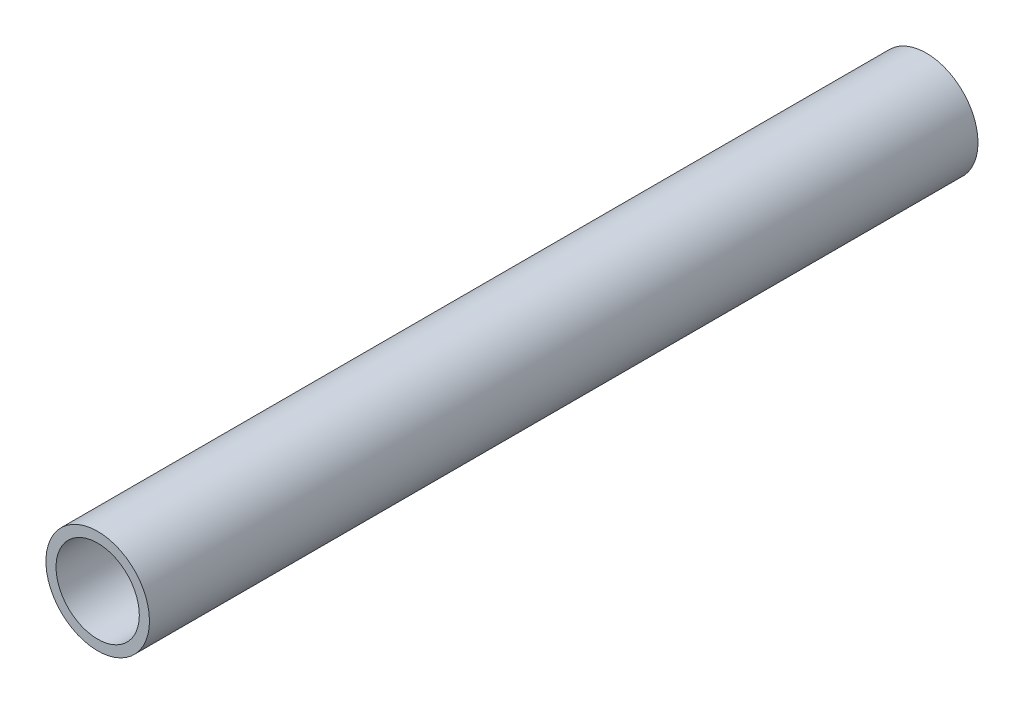
ISO-10303-21;
HEADER;
FILE_DESCRIPTION(('STEP AP214'),'2;1');
FILE_NAME('part.step','',(''),(''),'','','');
FILE_SCHEMA(('AUTOMOTIVE_DESIGN { 1 0 10303 214 1 1 1 1 }'));
ENDSEC;
DATA;
#1=APPLICATION_CONTEXT('core data for automotive mechanical design processes');
#2=APPLICATION_PROTOCOL_DEFINITION('international standard','automotive_design',2000,#1);
#3=PRODUCT_CONTEXT('',#1,'mechanical');
#4=PRODUCT('Part','Part','',(#3));
#5=PRODUCT_RELATED_PRODUCT_CATEGORY('part','',(#4));
#6=PRODUCT_DEFINITION_FORMATION('','',#4);
#7=PRODUCT_DEFINITION_CONTEXT('part definition',#1,'design');
#8=PRODUCT_DEFINITION('design','',#6,#7);
#9=PRODUCT_DEFINITION_SHAPE('','',#8);
#10=(LENGTH_UNIT() NAMED_UNIT(*) SI_UNIT(.MILLI.,.METRE.));
#11=(NAMED_UNIT(*) PLANE_ANGLE_UNIT() SI_UNIT($,.RADIAN.));
#12=(NAMED_UNIT(*) SI_UNIT($,.STERADIAN.) SOLID_ANGLE_UNIT());
#13=UNCERTAINTY_MEASURE_WITH_UNIT(LENGTH_MEASURE(1.E-05),#10,'distance_accuracy_value','');
#14=(GEOMETRIC_REPRESENTATION_CONTEXT(3) GLOBAL_UNCERTAINTY_ASSIGNED_CONTEXT((#13)) GLOBAL_UNIT_ASSIGNED_CONTEXT((#10,
#11,#12)) REPRESENTATION_CONTEXT('',''));
#15=CARTESIAN_POINT('',(0.,0.,0.));
#16=DIRECTION('',(0.,0.,1.));
#17=DIRECTION('',(1.,0.,0.));
#18=AXIS2_PLACEMENT_3D('',#15,#16,#17);
#19=CARTESIAN_POINT('',(0.,0.,25.4));
#20=DIRECTION('',(0.,0.,1.));
#21=DIRECTION('',(1.,0.,0.));
#22=AXIS2_PLACEMENT_3D('',#19,#20,#21);
#23=PLANE('',#22);
#24=CARTESIAN_POINT('',(0.,0.,25.4));
#25=DIRECTION('',(0.,0.,1.));
#26=DIRECTION('',(1.,0.,0.));
#27=AXIS2_PLACEMENT_3D('',#24,#25,#26);
#28=CIRCLE('',#27,3.175);
#29=CARTESIAN_POINT('',(3.175,0.,25.4));
#30=VERTEX_POINT('',#29);
#31=EDGE_CURVE('E10',#30,#30,#28,.T.);
#32=ORIENTED_EDGE('',*,*,#31,.T.);
#33=EDGE_LOOP('',(#32));
#34=FACE_BOUND('',#33,.T.);
#35=CARTESIAN_POINT('',(0.,0.,25.4));
#36=DIRECTION('',(0.,0.,1.));
#37=DIRECTION('',(1.,0.,0.));
#38=AXIS2_PLACEMENT_3D('',#35,#36,#37);
#39=CIRCLE('',#38,2.5527);
#40=CARTESIAN_POINT('',(2.5527,0.,25.4));
#41=VERTEX_POINT('',#40);
#42=EDGE_CURVE('E42',#41,#41,#39,.T.);
#43=ORIENTED_EDGE('',*,*,#42,.F.);
#44=EDGE_LOOP('',(#43));
#45=FACE_BOUND('',#44,.T.);
#46=ADVANCED_FACE('F31',(#34,#45),#23,.T.);
#47=CARTESIAN_POINT('',(0.,0.,-25.4));
#48=DIRECTION('',(0.,0.,1.));
#49=DIRECTION('',(1.,0.,0.));
#50=AXIS2_PLACEMENT_3D('',#47,#48,#49);
#51=PLANE('',#50);
#52=CARTESIAN_POINT('',(0.,0.,-25.4));
#53=DIRECTION('',(0.,0.,1.));
#54=DIRECTION('',(1.,0.,0.));
#55=AXIS2_PLACEMENT_3D('',#52,#53,#54);
#56=CIRCLE('',#55,3.175);
#57=CARTESIAN_POINT('',(3.175,0.,-25.4));
#58=VERTEX_POINT('',#57);
#59=EDGE_CURVE('E35',#58,#58,#56,.T.);
#60=ORIENTED_EDGE('',*,*,#59,.F.);
#61=EDGE_LOOP('',(#60));
#62=FACE_BOUND('',#61,.T.);
#63=CARTESIAN_POINT('',(0.,0.,-25.4));
#64=DIRECTION('',(0.,0.,1.));
#65=DIRECTION('',(1.,0.,0.));
#66=AXIS2_PLACEMENT_3D('',#63,#64,#65);
#67=CIRCLE('',#66,2.5527);
#68=CARTESIAN_POINT('',(2.5527,0.,-25.4));
#69=VERTEX_POINT('',#68);
#70=EDGE_CURVE('E44',#69,#69,#67,.T.);
#71=ORIENTED_EDGE('',*,*,#70,.T.);
#72=EDGE_LOOP('',(#71));
#73=FACE_BOUND('',#72,.T.);
#74=ADVANCED_FACE('F54',(#62,#73),#51,.F.);
#75=CARTESIAN_POINT('',(0.,0.,25.4));
#76=DIRECTION('',(0.,0.,-1.));
#77=DIRECTION('',(-1.,0.,0.));
#78=AXIS2_PLACEMENT_3D('',#75,#76,#77);
#79=CYLINDRICAL_SURFACE('',#78,3.175);
#80=ORIENTED_EDGE('',*,*,#31,.F.);
#81=EDGE_LOOP('',(#80));
#82=FACE_BOUND('',#81,.T.);
#83=ORIENTED_EDGE('',*,*,#59,.T.);
#84=EDGE_LOOP('',(#83));
#85=FACE_BOUND('',#84,.T.);
#86=ADVANCED_FACE('F33',(#82,#85),#79,.T.);
#87=CARTESIAN_POINT('',(0.,0.,25.4));
#88=DIRECTION('',(0.,0.,-1.));
#89=DIRECTION('',(-1.,0.,0.));
#90=AXIS2_PLACEMENT_3D('',#87,#88,#89);
#91=CYLINDRICAL_SURFACE('',#90,2.5527);
#92=ORIENTED_EDGE('',*,*,#42,.T.);
#93=EDGE_LOOP('',(#92));
#94=FACE_BOUND('',#93,.T.);
#95=ORIENTED_EDGE('',*,*,#70,.F.);
#96=EDGE_LOOP('',(#95));
#97=FACE_BOUND('',#96,.T.);
#98=ADVANCED_FACE('F50',(#94,#97),#91,.F.);
#99=CLOSED_SHELL('',(#46,#74,#86,#98));
#100=MANIFOLD_SOLID_BREP('B2',#99);
#101=ADVANCED_BREP_SHAPE_REPRESENTATION('',(#18,#100),#14);
#102=SHAPE_DEFINITION_REPRESENTATION(#9,#101);
ENDSEC;
END-ISO-10303-21;
